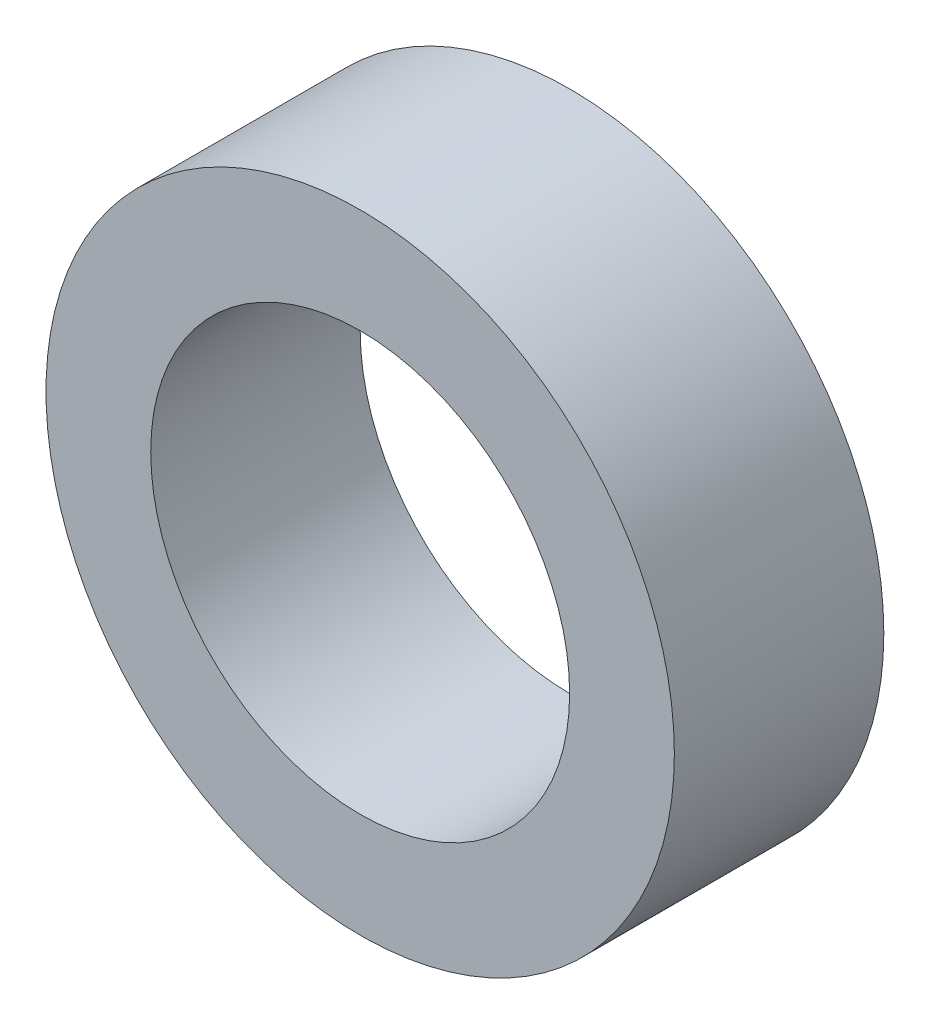
ISO-10303-21;
HEADER;
FILE_DESCRIPTION(('STEP AP214'),'2;1');
FILE_NAME('part.step','',(''),(''),'','','');
FILE_SCHEMA(('AUTOMOTIVE_DESIGN { 1 0 10303 214 1 1 1 1 }'));
ENDSEC;
DATA;
#1=APPLICATION_CONTEXT('core data for automotive mechanical design processes');
#2=APPLICATION_PROTOCOL_DEFINITION('international standard','automotive_design',2000,#1);
#3=PRODUCT_CONTEXT('',#1,'mechanical');
#4=PRODUCT('Part','Part','',(#3));
#5=PRODUCT_RELATED_PRODUCT_CATEGORY('part','',(#4));
#6=PRODUCT_DEFINITION_FORMATION('','',#4);
#7=PRODUCT_DEFINITION_CONTEXT('part definition',#1,'design');
#8=PRODUCT_DEFINITION('design','',#6,#7);
#9=PRODUCT_DEFINITION_SHAPE('','',#8);
#10=(LENGTH_UNIT() NAMED_UNIT(*) SI_UNIT(.MILLI.,.METRE.));
#11=(NAMED_UNIT(*) PLANE_ANGLE_UNIT() SI_UNIT($,.RADIAN.));
#12=(NAMED_UNIT(*) SI_UNIT($,.STERADIAN.) SOLID_ANGLE_UNIT());
#13=UNCERTAINTY_MEASURE_WITH_UNIT(LENGTH_MEASURE(1.E-05),#10,'distance_accuracy_value','');
#14=(GEOMETRIC_REPRESENTATION_CONTEXT(3) GLOBAL_UNCERTAINTY_ASSIGNED_CONTEXT((#13)) GLOBAL_UNIT_ASSIGNED_CONTEXT((#10,
#11,#12)) REPRESENTATION_CONTEXT('',''));
#15=CARTESIAN_POINT('',(0.,0.,0.));
#16=DIRECTION('',(0.,0.,1.));
#17=DIRECTION('',(1.,0.,0.));
#18=AXIS2_PLACEMENT_3D('',#15,#16,#17);
#19=CARTESIAN_POINT('',(0.,0.,0.9525));
#20=DIRECTION('',(0.,0.,1.));
#21=DIRECTION('',(1.,0.,0.));
#22=AXIS2_PLACEMENT_3D('',#19,#20,#21);
#23=PLANE('',#22);
#24=CARTESIAN_POINT('',(0.,0.,0.9525));
#25=DIRECTION('',(0.,0.,1.));
#26=DIRECTION('',(1.,0.,0.));
#27=AXIS2_PLACEMENT_3D('',#24,#25,#26);
#28=CIRCLE('',#27,2.8575);
#29=CARTESIAN_POINT('',(2.8575,0.,0.9525));
#30=VERTEX_POINT('',#29);
#31=EDGE_CURVE('E10',#30,#30,#28,.T.);
#32=ORIENTED_EDGE('',*,*,#31,.T.);
#33=EDGE_LOOP('',(#32));
#34=FACE_BOUND('',#33,.T.);
#35=CARTESIAN_POINT('',(0.,0.,0.9525));
#36=DIRECTION('',(0.,0.,1.));
#37=DIRECTION('',(1.,0.,0.));
#38=AXIS2_PLACEMENT_3D('',#35,#36,#37);
#39=CIRCLE('',#38,1.905);
#40=CARTESIAN_POINT('',(1.905,0.,0.9525));
#41=VERTEX_POINT('',#40);
#42=EDGE_CURVE('E48',#41,#41,#39,.T.);
#43=ORIENTED_EDGE('',*,*,#42,.F.);
#44=EDGE_LOOP('',(#43));
#45=FACE_BOUND('',#44,.T.);
#46=ADVANCED_FACE('F37',(#34,#45),#23,.T.);
#47=CARTESIAN_POINT('',(0.,0.,-0.9525));
#48=DIRECTION('',(0.,0.,1.));
#49=DIRECTION('',(1.,0.,0.));
#50=AXIS2_PLACEMENT_3D('',#47,#48,#49);
#51=PLANE('',#50);
#52=CARTESIAN_POINT('',(0.,0.,-0.9525));
#53=DIRECTION('',(0.,0.,1.));
#54=DIRECTION('',(1.,0.,0.));
#55=AXIS2_PLACEMENT_3D('',#52,#53,#54);
#56=CIRCLE('',#55,2.8575);
#57=CARTESIAN_POINT('',(2.8575,0.,-0.9525));
#58=VERTEX_POINT('',#57);
#59=EDGE_CURVE('E41',#58,#58,#56,.T.);
#60=ORIENTED_EDGE('',*,*,#59,.F.);
#61=EDGE_LOOP('',(#60));
#62=FACE_BOUND('',#61,.T.);
#63=CARTESIAN_POINT('',(0.,0.,-0.9525));
#64=DIRECTION('',(0.,0.,1.));
#65=DIRECTION('',(1.,0.,0.));
#66=AXIS2_PLACEMENT_3D('',#63,#64,#65);
#67=CIRCLE('',#66,1.905);
#68=CARTESIAN_POINT('',(1.905,0.,-0.9525));
#69=VERTEX_POINT('',#68);
#70=EDGE_CURVE('E50',#69,#69,#67,.T.);
#71=ORIENTED_EDGE('',*,*,#70,.T.);
#72=EDGE_LOOP('',(#71));
#73=FACE_BOUND('',#72,.T.);
#74=ADVANCED_FACE('F60',(#62,#73),#51,.F.);
#75=CARTESIAN_POINT('',(0.,0.,0.9525));
#76=DIRECTION('',(0.,0.,-1.));
#77=DIRECTION('',(-1.,0.,0.));
#78=AXIS2_PLACEMENT_3D('',#75,#76,#77);
#79=CYLINDRICAL_SURFACE('',#78,2.8575);
#80=ORIENTED_EDGE('',*,*,#31,.F.);
#81=EDGE_LOOP('',(#80));
#82=FACE_BOUND('',#81,.T.);
#83=ORIENTED_EDGE('',*,*,#59,.T.);
#84=EDGE_LOOP('',(#83));
#85=FACE_BOUND('',#84,.T.);
#86=ADVANCED_FACE('F39',(#82,#85),#79,.T.);
#87=CARTESIAN_POINT('',(0.,0.,0.9525));
#88=DIRECTION('',(0.,0.,-1.));
#89=DIRECTION('',(-1.,0.,0.));
#90=AXIS2_PLACEMENT_3D('',#87,#88,#89);
#91=CYLINDRICAL_SURFACE('',#90,1.905);
#92=ORIENTED_EDGE('',*,*,#42,.T.);
#93=EDGE_LOOP('',(#92));
#94=FACE_BOUND('',#93,.T.);
#95=ORIENTED_EDGE('',*,*,#70,.F.);
#96=EDGE_LOOP('',(#95));
#97=FACE_BOUND('',#96,.T.);
#98=ADVANCED_FACE('F56',(#94,#97),#91,.F.);
#99=CLOSED_SHELL('',(#46,#74,#86,#98));
#100=MANIFOLD_SOLID_BREP('B2',#99);
#101=ADVANCED_BREP_SHAPE_REPRESENTATION('',(#18,#100),#14);
#102=SHAPE_DEFINITION_REPRESENTATION(#9,#101);
ENDSEC;
END-ISO-10303-21;
